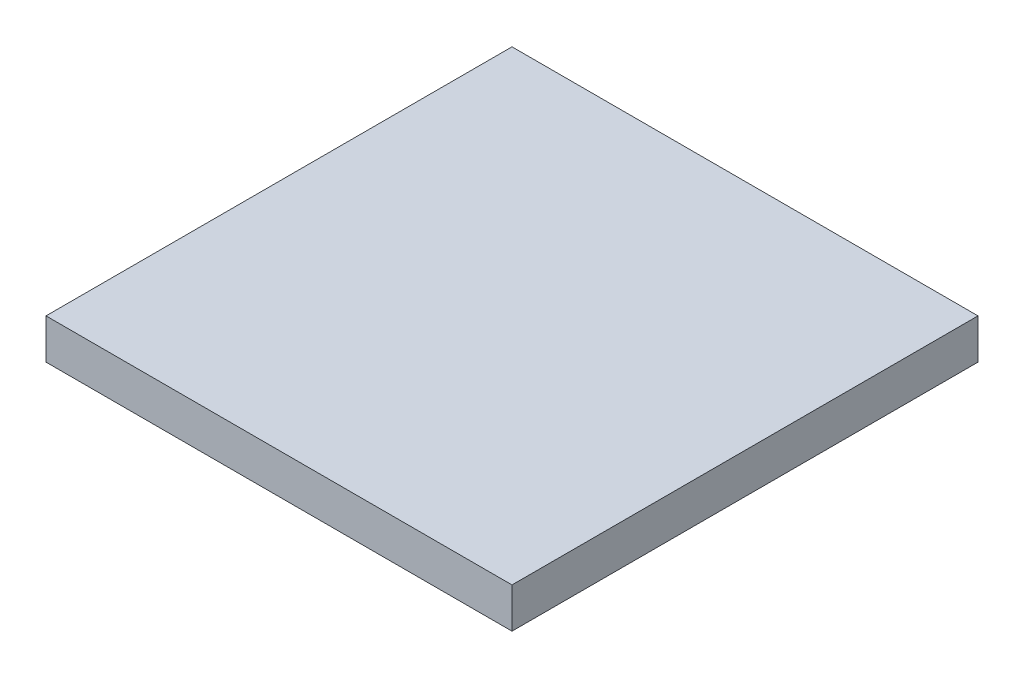
ISO-10303-21;
HEADER;
FILE_DESCRIPTION(('STEP AP214'),'2;1');
FILE_NAME('part.step','',(''),(''),'','','');
FILE_SCHEMA(('AUTOMOTIVE_DESIGN { 1 0 10303 214 1 1 1 1 }'));
ENDSEC;
DATA;
#1=APPLICATION_CONTEXT('core data for automotive mechanical design processes');
#2=APPLICATION_PROTOCOL_DEFINITION('international standard','automotive_design',2000,#1);
#3=PRODUCT_CONTEXT('',#1,'mechanical');
#4=PRODUCT('Part','Part','',(#3));
#5=PRODUCT_RELATED_PRODUCT_CATEGORY('part','',(#4));
#6=PRODUCT_DEFINITION_FORMATION('','',#4);
#7=PRODUCT_DEFINITION_CONTEXT('part definition',#1,'design');
#8=PRODUCT_DEFINITION('design','',#6,#7);
#9=PRODUCT_DEFINITION_SHAPE('','',#8);
#10=(LENGTH_UNIT() NAMED_UNIT(*) SI_UNIT(.MILLI.,.METRE.));
#11=(NAMED_UNIT(*) PLANE_ANGLE_UNIT() SI_UNIT($,.RADIAN.));
#12=(NAMED_UNIT(*) SI_UNIT($,.STERADIAN.) SOLID_ANGLE_UNIT());
#13=UNCERTAINTY_MEASURE_WITH_UNIT(LENGTH_MEASURE(1.E-05),#10,'distance_accuracy_value','');
#14=(GEOMETRIC_REPRESENTATION_CONTEXT(3) GLOBAL_UNCERTAINTY_ASSIGNED_CONTEXT((#13)) GLOBAL_UNIT_ASSIGNED_CONTEXT((#10,
#11,#12)) REPRESENTATION_CONTEXT('',''));
#15=CARTESIAN_POINT('',(0.,0.,0.));
#16=DIRECTION('',(0.,0.,1.));
#17=DIRECTION('',(1.,0.,0.));
#18=AXIS2_PLACEMENT_3D('',#15,#16,#17);
#19=CARTESIAN_POINT('',(-1044.537705685,258.,-452.724341639257));
#20=DIRECTION('',(1.,0.,0.));
#21=DIRECTION('',(0.,0.,-1.));
#22=AXIS2_PLACEMENT_3D('',#19,#20,#21);
#23=PLANE('',#22);
#24=DIRECTION('',(0.,0.,1.));
#25=VECTOR('',#24,1.);
#26=CARTESIAN_POINT('',(-1044.537705685,0.,-452.724341639257));
#27=LINE('',#26,#25);
#28=CARTESIAN_POINT('',(-1044.537705685,0.,-452.724341639257));
#29=VERTEX_POINT('',#28);
#30=CARTESIAN_POINT('',(-1044.537705685,0.,2547.27565836074));
#31=VERTEX_POINT('',#30);
#32=EDGE_CURVE('E96',#29,#31,#27,.T.);
#33=ORIENTED_EDGE('',*,*,#32,.T.);
#34=DIRECTION('',(0.,-1.,0.));
#35=VECTOR('',#34,1.);
#36=CARTESIAN_POINT('',(-1044.537705685,258.,2547.27565836074));
#37=LINE('',#36,#35);
#38=CARTESIAN_POINT('',(-1044.537705685,258.,2547.27565836074));
#39=VERTEX_POINT('',#38);
#40=EDGE_CURVE('E11',#39,#31,#37,.T.);
#41=ORIENTED_EDGE('',*,*,#40,.F.);
#42=DIRECTION('',(0.,0.,1.));
#43=VECTOR('',#42,1.);
#44=CARTESIAN_POINT('',(-1044.537705685,258.,-452.724341639257));
#45=LINE('',#44,#43);
#46=CARTESIAN_POINT('',(-1044.537705685,258.,-452.724341639257));
#47=VERTEX_POINT('',#46);
#48=EDGE_CURVE('E84',#47,#39,#45,.T.);
#49=ORIENTED_EDGE('',*,*,#48,.F.);
#50=DIRECTION('',(0.,-1.,0.));
#51=VECTOR('',#50,1.);
#52=CARTESIAN_POINT('',(-1044.537705685,258.,-452.724341639257));
#53=LINE('',#52,#51);
#54=EDGE_CURVE('E92',#47,#29,#53,.T.);
#55=ORIENTED_EDGE('',*,*,#54,.T.);
#56=EDGE_LOOP('',(#33,#41,#49,#55));
#57=FACE_BOUND('',#56,.T.);
#58=ADVANCED_FACE('F33',(#57),#23,.F.);
#59=CARTESIAN_POINT('',(-1044.537705685,258.,2547.27565836074));
#60=DIRECTION('',(0.,0.,-1.));
#61=DIRECTION('',(-1.,0.,0.));
#62=AXIS2_PLACEMENT_3D('',#59,#60,#61);
#63=PLANE('',#62);
#64=DIRECTION('',(1.,0.,0.));
#65=VECTOR('',#64,1.);
#66=CARTESIAN_POINT('',(-1044.537705685,0.,2547.27565836074));
#67=LINE('',#66,#65);
#68=CARTESIAN_POINT('',(1955.462294315,0.,2547.27565836074));
#69=VERTEX_POINT('',#68);
#70=EDGE_CURVE('E88',#31,#69,#67,.T.);
#71=ORIENTED_EDGE('',*,*,#70,.T.);
#72=DIRECTION('',(0.,-1.,0.));
#73=VECTOR('',#72,1.);
#74=CARTESIAN_POINT('',(1955.462294315,258.,2547.27565836074));
#75=LINE('',#74,#73);
#76=CARTESIAN_POINT('',(1955.462294315,258.,2547.27565836074));
#77=VERTEX_POINT('',#76);
#78=EDGE_CURVE('E41',#77,#69,#75,.T.);
#79=ORIENTED_EDGE('',*,*,#78,.F.);
#80=DIRECTION('',(1.,0.,0.));
#81=VECTOR('',#80,1.);
#82=CARTESIAN_POINT('',(-1044.537705685,258.,2547.27565836074));
#83=LINE('',#82,#81);
#84=EDGE_CURVE('E79',#39,#77,#83,.T.);
#85=ORIENTED_EDGE('',*,*,#84,.F.);
#86=ORIENTED_EDGE('',*,*,#40,.T.);
#87=EDGE_LOOP('',(#71,#79,#85,#86));
#88=FACE_BOUND('',#87,.T.);
#89=ADVANCED_FACE('F87',(#88),#63,.F.);
#90=CARTESIAN_POINT('',(1955.462294315,258.,-452.724341639257));
#91=DIRECTION('',(-1.,0.,0.));
#92=DIRECTION('',(0.,0.,1.));
#93=AXIS2_PLACEMENT_3D('',#90,#91,#92);
#94=PLANE('',#93);
#95=DIRECTION('',(0.,0.,-1.));
#96=VECTOR('',#95,1.);
#97=CARTESIAN_POINT('',(1955.462294315,0.,-452.724341639257));
#98=LINE('',#97,#96);
#99=CARTESIAN_POINT('',(1955.462294315,0.,-452.724341639257));
#100=VERTEX_POINT('',#99);
#101=EDGE_CURVE('E66',#69,#100,#98,.T.);
#102=ORIENTED_EDGE('',*,*,#101,.T.);
#103=DIRECTION('',(0.,-1.,0.));
#104=VECTOR('',#103,1.);
#105=CARTESIAN_POINT('',(1955.462294315,258.,-452.724341639257));
#106=LINE('',#105,#104);
#107=CARTESIAN_POINT('',(1955.462294315,258.,-452.724341639257));
#108=VERTEX_POINT('',#107);
#109=EDGE_CURVE('E89',#108,#100,#106,.T.);
#110=ORIENTED_EDGE('',*,*,#109,.F.);
#111=DIRECTION('',(0.,0.,-1.));
#112=VECTOR('',#111,1.);
#113=CARTESIAN_POINT('',(1955.462294315,258.,-452.724341639257));
#114=LINE('',#113,#112);
#115=EDGE_CURVE('E82',#77,#108,#114,.T.);
#116=ORIENTED_EDGE('',*,*,#115,.F.);
#117=ORIENTED_EDGE('',*,*,#78,.T.);
#118=EDGE_LOOP('',(#102,#110,#116,#117));
#119=FACE_BOUND('',#118,.T.);
#120=ADVANCED_FACE('F90',(#119),#94,.F.);
#121=CARTESIAN_POINT('',(-1044.537705685,258.,-452.724341639257));
#122=DIRECTION('',(0.,0.,1.));
#123=DIRECTION('',(1.,0.,0.));
#124=AXIS2_PLACEMENT_3D('',#121,#122,#123);
#125=PLANE('',#124);
#126=DIRECTION('',(-1.,0.,0.));
#127=VECTOR('',#126,1.);
#128=CARTESIAN_POINT('',(-1044.537705685,0.,-452.724341639257));
#129=LINE('',#128,#127);
#130=EDGE_CURVE('E72',#100,#29,#129,.T.);
#131=ORIENTED_EDGE('',*,*,#130,.T.);
#132=ORIENTED_EDGE('',*,*,#54,.F.);
#133=DIRECTION('',(-1.,0.,0.));
#134=VECTOR('',#133,1.);
#135=CARTESIAN_POINT('',(-1044.537705685,258.,-452.724341639257));
#136=LINE('',#135,#134);
#137=EDGE_CURVE('E49',#108,#47,#136,.T.);
#138=ORIENTED_EDGE('',*,*,#137,.F.);
#139=ORIENTED_EDGE('',*,*,#109,.T.);
#140=EDGE_LOOP('',(#131,#132,#138,#139));
#141=FACE_BOUND('',#140,.T.);
#142=ADVANCED_FACE('F103',(#141),#125,.F.);
#143=CARTESIAN_POINT('',(0.,258.,0.));
#144=DIRECTION('',(0.,1.,0.));
#145=DIRECTION('',(0.,0.,1.));
#146=AXIS2_PLACEMENT_3D('',#143,#144,#145);
#147=PLANE('',#146);
#148=ORIENTED_EDGE('',*,*,#48,.T.);
#149=ORIENTED_EDGE('',*,*,#84,.T.);
#150=ORIENTED_EDGE('',*,*,#115,.T.);
#151=ORIENTED_EDGE('',*,*,#137,.T.);
#152=EDGE_LOOP('',(#148,#149,#150,#151));
#153=FACE_BOUND('',#152,.T.);
#154=ADVANCED_FACE('F80',(#153),#147,.T.);
#155=CARTESIAN_POINT('',(0.,0.,0.));
#156=DIRECTION('',(0.,1.,0.));
#157=DIRECTION('',(0.,0.,1.));
#158=AXIS2_PLACEMENT_3D('',#155,#156,#157);
#159=PLANE('',#158);
#160=ORIENTED_EDGE('',*,*,#32,.F.);
#161=ORIENTED_EDGE('',*,*,#130,.F.);
#162=ORIENTED_EDGE('',*,*,#101,.F.);
#163=ORIENTED_EDGE('',*,*,#70,.F.);
#164=EDGE_LOOP('',(#160,#161,#162,#163));
#165=FACE_BOUND('',#164,.T.);
#166=ADVANCED_FACE('F106',(#165),#159,.F.);
#167=CLOSED_SHELL('',(#58,#89,#120,#142,#154,#166));
#168=MANIFOLD_SOLID_BREP('B2',#167);
#169=ADVANCED_BREP_SHAPE_REPRESENTATION('',(#18,#168),#14);
#170=SHAPE_DEFINITION_REPRESENTATION(#9,#169);
ENDSEC;
END-ISO-10303-21;
